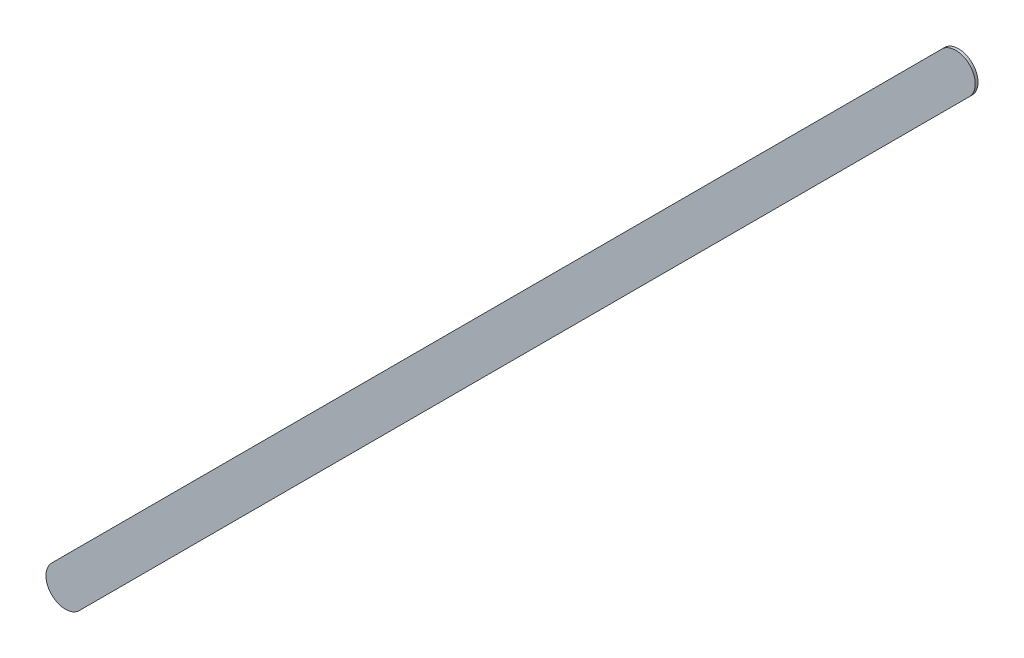
ISO-10303-21;
HEADER;
FILE_DESCRIPTION(('STEP AP214'),'2;1');
FILE_NAME('part.step','',(''),(''),'','','');
FILE_SCHEMA(('AUTOMOTIVE_DESIGN { 1 0 10303 214 1 1 1 1 }'));
ENDSEC;
DATA;
#1=APPLICATION_CONTEXT('core data for automotive mechanical design processes');
#2=APPLICATION_PROTOCOL_DEFINITION('international standard','automotive_design',2000,#1);
#3=PRODUCT_CONTEXT('',#1,'mechanical');
#4=PRODUCT('Part','Part','',(#3));
#5=PRODUCT_RELATED_PRODUCT_CATEGORY('part','',(#4));
#6=PRODUCT_DEFINITION_FORMATION('','',#4);
#7=PRODUCT_DEFINITION_CONTEXT('part definition',#1,'design');
#8=PRODUCT_DEFINITION('design','',#6,#7);
#9=PRODUCT_DEFINITION_SHAPE('','',#8);
#10=(LENGTH_UNIT() NAMED_UNIT(*) SI_UNIT(.MILLI.,.METRE.));
#11=(NAMED_UNIT(*) PLANE_ANGLE_UNIT() SI_UNIT($,.RADIAN.));
#12=(NAMED_UNIT(*) SI_UNIT($,.STERADIAN.) SOLID_ANGLE_UNIT());
#13=UNCERTAINTY_MEASURE_WITH_UNIT(LENGTH_MEASURE(1.E-05),#10,'distance_accuracy_value','');
#14=(GEOMETRIC_REPRESENTATION_CONTEXT(3) GLOBAL_UNCERTAINTY_ASSIGNED_CONTEXT((#13)) GLOBAL_UNIT_ASSIGNED_CONTEXT((#10,
#11,#12)) REPRESENTATION_CONTEXT('',''));
#15=CARTESIAN_POINT('',(0.,0.,0.));
#16=DIRECTION('',(0.,0.,1.));
#17=DIRECTION('',(1.,0.,0.));
#18=AXIS2_PLACEMENT_3D('',#15,#16,#17);
#19=CARTESIAN_POINT('',(66.12457438,102.87102362,0.));
#20=DIRECTION('',(-0.707106781186548,0.707106781186548,0.));
#21=DIRECTION('',(0.707106781186548,0.707106781186548,0.));
#22=AXIS2_PLACEMENT_3D('',#19,#20,#21);
#23=PLANE('',#22);
#24=DIRECTION('',(0.707106781186548,0.707106781186548,0.));
#25=VECTOR('',#24,1.);
#26=CARTESIAN_POINT('',(66.12457438,102.87102362,0.03556));
#27=LINE('',#26,#25);
#28=CARTESIAN_POINT('',(66.12457438,102.87102362,0.03556));
#29=VERTEX_POINT('',#28);
#30=CARTESIAN_POINT('',(77.56478518,114.31123442,0.03556));
#31=VERTEX_POINT('',#30);
#32=EDGE_CURVE('E11',#29,#31,#27,.T.);
#33=ORIENTED_EDGE('',*,*,#32,.F.);
#34=DIRECTION('',(0.,0.,1.));
#35=VECTOR('',#34,1.);
#36=CARTESIAN_POINT('',(66.12457438,102.87102362,0.));
#37=LINE('',#36,#35);
#38=CARTESIAN_POINT('',(66.12457438,102.87102362,0.));
#39=VERTEX_POINT('',#38);
#40=EDGE_CURVE('E24',#39,#29,#37,.T.);
#41=ORIENTED_EDGE('',*,*,#40,.F.);
#42=DIRECTION('',(0.707106781186548,0.707106781186548,0.));
#43=VECTOR('',#42,1.);
#44=CARTESIAN_POINT('',(66.12457438,102.87102362,0.));
#45=LINE('',#44,#43);
#46=CARTESIAN_POINT('',(77.56478518,114.31123442,0.));
#47=VERTEX_POINT('',#46);
#48=EDGE_CURVE('E75',#39,#47,#45,.T.);
#49=ORIENTED_EDGE('',*,*,#48,.T.);
#50=DIRECTION('',(0.,0.,1.));
#51=VECTOR('',#50,1.);
#52=CARTESIAN_POINT('',(77.56478518,114.31123442,0.));
#53=LINE('',#52,#51);
#54=EDGE_CURVE('E37',#47,#31,#53,.T.);
#55=ORIENTED_EDGE('',*,*,#54,.T.);
#56=EDGE_LOOP('',(#33,#41,#49,#55));
#57=FACE_BOUND('',#56,.T.);
#58=ADVANCED_FACE('F17',(#57),#23,.F.);
#59=CARTESIAN_POINT('',(77.3880088,114.4880108,0.));
#60=DIRECTION('',(0.,0.,-1.));
#61=DIRECTION('',(0.707106781186576,-0.707106781186519,0.));
#62=AXIS2_PLACEMENT_3D('',#59,#60,#61);
#63=CYLINDRICAL_SURFACE('',#62,0.249999554103226);
#64=CARTESIAN_POINT('',(77.3880088,114.4880108,0.03556));
#65=DIRECTION('',(0.,0.,1.));
#66=DIRECTION('',(0.707106781186576,-0.707106781186519,0.));
#67=AXIS2_PLACEMENT_3D('',#64,#65,#66);
#68=CIRCLE('',#67,0.249999554103226);
#69=CARTESIAN_POINT('',(77.21123242,114.66478718,0.03556));
#70=VERTEX_POINT('',#69);
#71=EDGE_CURVE('E83',#31,#70,#68,.T.);
#72=ORIENTED_EDGE('',*,*,#71,.F.);
#73=ORIENTED_EDGE('',*,*,#54,.F.);
#74=CARTESIAN_POINT('',(77.3880088,114.4880108,0.));
#75=DIRECTION('',(0.,0.,1.));
#76=DIRECTION('',(0.707106781186576,-0.707106781186519,0.));
#77=AXIS2_PLACEMENT_3D('',#74,#75,#76);
#78=CIRCLE('',#77,0.249999554103226);
#79=CARTESIAN_POINT('',(77.21123242,114.66478718,0.));
#80=VERTEX_POINT('',#79);
#81=EDGE_CURVE('E81',#47,#80,#78,.T.);
#82=ORIENTED_EDGE('',*,*,#81,.T.);
#83=DIRECTION('',(0.,0.,1.));
#84=VECTOR('',#83,1.);
#85=CARTESIAN_POINT('',(77.21123242,114.66478718,0.));
#86=LINE('',#85,#84);
#87=EDGE_CURVE('E67',#80,#70,#86,.T.);
#88=ORIENTED_EDGE('',*,*,#87,.T.);
#89=EDGE_LOOP('',(#72,#73,#82,#88));
#90=FACE_BOUND('',#89,.T.);
#91=ADVANCED_FACE('F89',(#90),#63,.T.);
#92=CARTESIAN_POINT('',(77.21123242,114.66478718,0.));
#93=DIRECTION('',(0.707106781186548,-0.707106781186548,0.));
#94=DIRECTION('',(-0.707106781186548,-0.707106781186548,0.));
#95=AXIS2_PLACEMENT_3D('',#92,#93,#94);
#96=PLANE('',#95);
#97=DIRECTION('',(-0.707106781186548,-0.707106781186548,0.));
#98=VECTOR('',#97,1.);
#99=CARTESIAN_POINT('',(77.21123242,114.66478718,0.03556));
#100=LINE('',#99,#98);
#101=CARTESIAN_POINT('',(65.77102162,103.22457638,0.03556));
#102=VERTEX_POINT('',#101);
#103=EDGE_CURVE('E71',#70,#102,#100,.T.);
#104=ORIENTED_EDGE('',*,*,#103,.F.);
#105=ORIENTED_EDGE('',*,*,#87,.F.);
#106=DIRECTION('',(-0.707106781186548,-0.707106781186548,0.));
#107=VECTOR('',#106,1.);
#108=CARTESIAN_POINT('',(77.21123242,114.66478718,0.));
#109=LINE('',#108,#107);
#110=CARTESIAN_POINT('',(65.77102162,103.22457638,0.));
#111=VERTEX_POINT('',#110);
#112=EDGE_CURVE('E63',#80,#111,#109,.T.);
#113=ORIENTED_EDGE('',*,*,#112,.T.);
#114=DIRECTION('',(0.,0.,1.));
#115=VECTOR('',#114,1.);
#116=CARTESIAN_POINT('',(65.77102162,103.22457638,0.));
#117=LINE('',#116,#115);
#118=EDGE_CURVE('E53',#111,#102,#117,.T.);
#119=ORIENTED_EDGE('',*,*,#118,.T.);
#120=EDGE_LOOP('',(#104,#105,#113,#119));
#121=FACE_BOUND('',#120,.T.);
#122=ADVANCED_FACE('F66',(#121),#96,.F.);
#123=CARTESIAN_POINT('',(65.947798,103.0478,0.));
#124=DIRECTION('',(0.,0.,-1.));
#125=DIRECTION('',(-0.707106781186548,0.707106781186548,0.));
#126=AXIS2_PLACEMENT_3D('',#123,#124,#125);
#127=CYLINDRICAL_SURFACE('',#126,0.249999554103226);
#128=CARTESIAN_POINT('',(65.947798,103.0478,0.03556));
#129=DIRECTION('',(0.,0.,1.));
#130=DIRECTION('',(-0.707106781186548,0.707106781186548,0.));
#131=AXIS2_PLACEMENT_3D('',#128,#129,#130);
#132=CIRCLE('',#131,0.249999554103226);
#133=EDGE_CURVE('E59',#102,#29,#132,.T.);
#134=ORIENTED_EDGE('',*,*,#133,.F.);
#135=ORIENTED_EDGE('',*,*,#118,.F.);
#136=CARTESIAN_POINT('',(65.947798,103.0478,0.));
#137=DIRECTION('',(0.,0.,1.));
#138=DIRECTION('',(-0.707106781186548,0.707106781186548,0.));
#139=AXIS2_PLACEMENT_3D('',#136,#137,#138);
#140=CIRCLE('',#139,0.249999554103226);
#141=EDGE_CURVE('E57',#111,#39,#140,.T.);
#142=ORIENTED_EDGE('',*,*,#141,.T.);
#143=ORIENTED_EDGE('',*,*,#40,.T.);
#144=EDGE_LOOP('',(#134,#135,#142,#143));
#145=FACE_BOUND('',#144,.T.);
#146=ADVANCED_FACE('F55',(#145),#127,.T.);
#147=CARTESIAN_POINT('',(66.12457438,102.87102362,0.));
#148=DIRECTION('',(0.,0.,-1.));
#149=DIRECTION('',(-1.,0.,0.));
#150=AXIS2_PLACEMENT_3D('',#147,#148,#149);
#151=PLANE('',#150);
#152=ORIENTED_EDGE('',*,*,#141,.F.);
#153=ORIENTED_EDGE('',*,*,#112,.F.);
#154=ORIENTED_EDGE('',*,*,#81,.F.);
#155=ORIENTED_EDGE('',*,*,#48,.F.);
#156=EDGE_LOOP('',(#152,#153,#154,#155));
#157=FACE_BOUND('',#156,.T.);
#158=ADVANCED_FACE('F74',(#157),#151,.T.);
#159=CARTESIAN_POINT('',(66.12457438,102.87102362,0.03556));
#160=DIRECTION('',(0.,0.,-1.));
#161=DIRECTION('',(-1.,0.,0.));
#162=AXIS2_PLACEMENT_3D('',#159,#160,#161);
#163=PLANE('',#162);
#164=ORIENTED_EDGE('',*,*,#32,.T.);
#165=ORIENTED_EDGE('',*,*,#71,.T.);
#166=ORIENTED_EDGE('',*,*,#103,.T.);
#167=ORIENTED_EDGE('',*,*,#133,.T.);
#168=EDGE_LOOP('',(#164,#165,#166,#167));
#169=FACE_BOUND('',#168,.T.);
#170=ADVANCED_FACE('F91',(#169),#163,.F.);
#171=CLOSED_SHELL('',(#58,#91,#122,#146,#158,#170));
#172=MANIFOLD_SOLID_BREP('B1',#171);
#173=ADVANCED_BREP_SHAPE_REPRESENTATION('',(#18,#172),#14);
#174=SHAPE_DEFINITION_REPRESENTATION(#9,#173);
ENDSEC;
END-ISO-10303-21;
